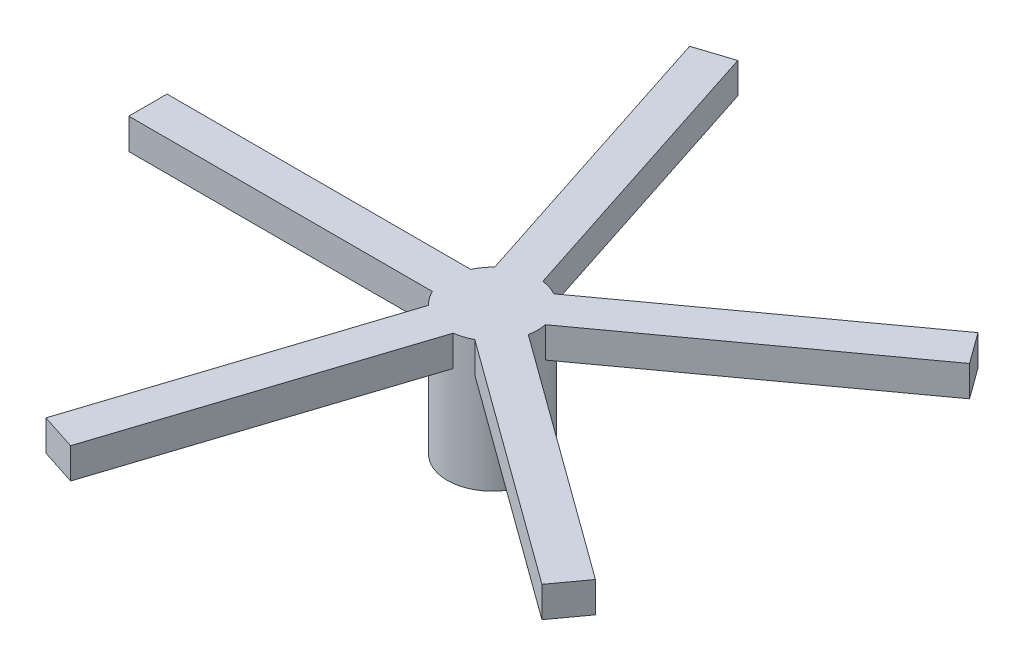
ISO-10303-21;
HEADER;
FILE_DESCRIPTION(('STEP AP214'),'2;1');
FILE_NAME('part.step','',(''),(''),'','','');
FILE_SCHEMA(('AUTOMOTIVE_DESIGN { 1 0 10303 214 1 1 1 1 }'));
ENDSEC;
DATA;
#1=APPLICATION_CONTEXT('core data for automotive mechanical design processes');
#2=APPLICATION_PROTOCOL_DEFINITION('international standard','automotive_design',2000,#1);
#3=PRODUCT_CONTEXT('',#1,'mechanical');
#4=PRODUCT('Part','Part','',(#3));
#5=PRODUCT_RELATED_PRODUCT_CATEGORY('part','',(#4));
#6=PRODUCT_DEFINITION_FORMATION('','',#4);
#7=PRODUCT_DEFINITION_CONTEXT('part definition',#1,'design');
#8=PRODUCT_DEFINITION('design','',#6,#7);
#9=PRODUCT_DEFINITION_SHAPE('','',#8);
#10=(LENGTH_UNIT() NAMED_UNIT(*) SI_UNIT(.MILLI.,.METRE.));
#11=(NAMED_UNIT(*) PLANE_ANGLE_UNIT() SI_UNIT($,.RADIAN.));
#12=(NAMED_UNIT(*) SI_UNIT($,.STERADIAN.) SOLID_ANGLE_UNIT());
#13=UNCERTAINTY_MEASURE_WITH_UNIT(LENGTH_MEASURE(1.E-05),#10,'distance_accuracy_value','');
#14=(GEOMETRIC_REPRESENTATION_CONTEXT(3) GLOBAL_UNCERTAINTY_ASSIGNED_CONTEXT((#13)) GLOBAL_UNIT_ASSIGNED_CONTEXT((#10,
#11,#12)) REPRESENTATION_CONTEXT('',''));
#15=CARTESIAN_POINT('',(0.,0.,0.));
#16=DIRECTION('',(0.,0.,1.));
#17=DIRECTION('',(1.,0.,0.));
#18=AXIS2_PLACEMENT_3D('',#15,#16,#17);
#19=CARTESIAN_POINT('',(0.,21.59,0.));
#20=DIRECTION('',(0.,-1.,0.));
#21=DIRECTION('',(0.,0.,-1.));
#22=AXIS2_PLACEMENT_3D('',#19,#20,#21);
#23=CYLINDRICAL_SURFACE('',#22,4.318);
#24=CARTESIAN_POINT('',(0.,0.,0.));
#25=DIRECTION('',(0.,1.,0.));
#26=DIRECTION('',(0.,0.,1.));
#27=AXIS2_PLACEMENT_3D('',#24,#25,#26);
#28=CIRCLE('',#27,4.318);
#29=CARTESIAN_POINT('',(0.,0.,4.318));
#30=VERTEX_POINT('',#29);
#31=EDGE_CURVE('E367',#30,#30,#28,.T.);
#32=ORIENTED_EDGE('',*,*,#31,.F.);
#33=EDGE_LOOP('',(#32));
#34=FACE_BOUND('',#33,.T.);
#35=CARTESIAN_POINT('',(0.,16.51,0.));
#36=DIRECTION('',(0.,1.,0.));
#37=DIRECTION('',(-1.,0.,0.));
#38=AXIS2_PLACEMENT_3D('',#35,#36,#37);
#39=CIRCLE('',#38,4.318);
#40=CARTESIAN_POINT('',(-4.318,16.51,0.));
#41=VERTEX_POINT('',#40);
#42=EDGE_CURVE('E11',#41,#41,#39,.T.);
#43=ORIENTED_EDGE('',*,*,#42,.T.);
#44=EDGE_LOOP('',(#43));
#45=FACE_BOUND('',#44,.T.);
#46=ADVANCED_FACE('F39',(#34,#45),#23,.F.);
#47=CARTESIAN_POINT('',(0.,21.59,0.));
#48=DIRECTION('',(0.,-1.,0.));
#49=DIRECTION('',(0.,0.,-1.));
#50=AXIS2_PLACEMENT_3D('',#47,#48,#49);
#51=CYLINDRICAL_SURFACE('',#50,7.493);
#52=CARTESIAN_POINT('',(0.,0.,0.));
#53=DIRECTION('',(0.,1.,0.));
#54=DIRECTION('',(0.,0.,1.));
#55=AXIS2_PLACEMENT_3D('',#52,#53,#54);
#56=CIRCLE('',#55,7.493);
#57=CARTESIAN_POINT('',(0.,0.,7.493));
#58=VERTEX_POINT('',#57);
#59=EDGE_CURVE('E371',#58,#58,#56,.T.);
#60=ORIENTED_EDGE('',*,*,#59,.T.);
#61=EDGE_LOOP('',(#60));
#62=FACE_BOUND('',#61,.T.);
#63=CARTESIAN_POINT('',(0.,16.51,0.));
#64=DIRECTION('',(0.,1.,0.));
#65=DIRECTION('',(0.,0.,1.));
#66=AXIS2_PLACEMENT_3D('',#63,#64,#65);
#67=CIRCLE('',#66,7.493);
#68=CARTESIAN_POINT('',(0.922282081097257,16.51,-7.43602345093713));
#69=VERTEX_POINT('',#68);
#70=CARTESIAN_POINT('',(-5.11692679737697,16.51,-5.47376553665623));
#71=VERTEX_POINT('',#70);
#72=EDGE_CURVE('E55',#69,#71,#67,.T.);
#73=ORIENTED_EDGE('',*,*,#72,.F.);
#74=DIRECTION('',(0.,-1.,0.));
#75=VECTOR('',#74,1.);
#76=CARTESIAN_POINT('',(0.92228208109726,21.59,-7.43602345093713));
#77=LINE('',#76,#75);
#78=CARTESIAN_POINT('',(0.922282081097259,21.59,-7.43602345093713));
#79=VERTEX_POINT('',#78);
#80=EDGE_CURVE('E324',#69,#79,#77,.F.);
#81=ORIENTED_EDGE('',*,*,#80,.T.);
#82=CARTESIAN_POINT('',(0.,21.59,0.));
#83=DIRECTION('',(0.,1.,0.));
#84=DIRECTION('',(0.,0.,1.));
#85=AXIS2_PLACEMENT_3D('',#82,#83,#84);
#86=CIRCLE('',#85,7.493);
#87=CARTESIAN_POINT('',(3.62464304294671,21.59,-6.55797314810132));
#88=VERTEX_POINT('',#87);
#89=EDGE_CURVE('E381',#88,#79,#86,.T.);
#90=ORIENTED_EDGE('',*,*,#89,.F.);
#91=DIRECTION('',(0.,-1.,0.));
#92=VECTOR('',#91,1.);
#93=CARTESIAN_POINT('',(3.6246430429467,21.59,-6.55797314810133));
#94=LINE('',#93,#92);
#95=CARTESIAN_POINT('',(3.6246430429467,16.51,-6.55797314810133));
#96=VERTEX_POINT('',#95);
#97=EDGE_CURVE('E317',#96,#88,#94,.F.);
#98=ORIENTED_EDGE('',*,*,#97,.F.);
#99=CARTESIAN_POINT('',(7.35707939500388,16.51,-1.42071523382039));
#100=VERTEX_POINT('',#99);
#101=EDGE_CURVE('E413',#100,#96,#67,.T.);
#102=ORIENTED_EDGE('',*,*,#101,.F.);
#103=DIRECTION('',(0.,-1.,0.));
#104=VECTOR('',#103,1.);
#105=CARTESIAN_POINT('',(7.35707939500388,21.59,-1.42071523382039));
#106=LINE('',#105,#104);
#107=CARTESIAN_POINT('',(7.35707939500388,21.59,-1.42071523382039));
#108=VERTEX_POINT('',#107);
#109=EDGE_CURVE('E321',#100,#108,#106,.F.);
#110=ORIENTED_EDGE('',*,*,#109,.T.);
#111=CARTESIAN_POINT('',(7.35707939500387,21.59,1.4207152338205));
#112=VERTEX_POINT('',#111);
#113=EDGE_CURVE('E387',#112,#108,#86,.T.);
#114=ORIENTED_EDGE('',*,*,#113,.F.);
#115=DIRECTION('',(0.,-1.,0.));
#116=VECTOR('',#115,1.);
#117=CARTESIAN_POINT('',(7.35707939500386,21.59,1.4207152338205));
#118=LINE('',#117,#116);
#119=CARTESIAN_POINT('',(7.35707939500386,16.51,1.4207152338205));
#120=VERTEX_POINT('',#119);
#121=EDGE_CURVE('E310',#120,#112,#118,.F.);
#122=ORIENTED_EDGE('',*,*,#121,.F.);
#123=CARTESIAN_POINT('',(3.62464304294661,16.51,6.55797314810138));
#124=VERTEX_POINT('',#123);
#125=EDGE_CURVE('E306',#124,#120,#67,.T.);
#126=ORIENTED_EDGE('',*,*,#125,.F.);
#127=DIRECTION('',(0.,-1.,0.));
#128=VECTOR('',#127,1.);
#129=CARTESIAN_POINT('',(3.62464304294661,21.59,6.55797314810138));
#130=LINE('',#129,#128);
#131=CARTESIAN_POINT('',(3.62464304294661,21.59,6.55797314810138));
#132=VERTEX_POINT('',#131);
#133=EDGE_CURVE('E314',#124,#132,#130,.F.);
#134=ORIENTED_EDGE('',*,*,#133,.T.);
#135=CARTESIAN_POINT('',(0.922282081097157,21.59,7.43602345093714));
#136=VERTEX_POINT('',#135);
#137=EDGE_CURVE('E374',#136,#132,#86,.T.);
#138=ORIENTED_EDGE('',*,*,#137,.F.);
#139=DIRECTION('',(0.,-1.,0.));
#140=VECTOR('',#139,1.);
#141=CARTESIAN_POINT('',(0.922282081097155,21.59,7.43602345093714));
#142=LINE('',#141,#140);
#143=CARTESIAN_POINT('',(0.922282081097155,16.51,7.43602345093714));
#144=VERTEX_POINT('',#143);
#145=EDGE_CURVE('E307',#144,#136,#142,.F.);
#146=ORIENTED_EDGE('',*,*,#145,.F.);
#147=CARTESIAN_POINT('',(-5.11692679737705,16.51,5.47376553665616));
#148=VERTEX_POINT('',#147);
#149=EDGE_CURVE('E183',#148,#144,#67,.T.);
#150=ORIENTED_EDGE('',*,*,#149,.F.);
#151=DIRECTION('',(0.,-1.,0.));
#152=VECTOR('',#151,1.);
#153=CARTESIAN_POINT('',(-5.11692679737705,21.59,5.47376553665616));
#154=LINE('',#153,#152);
#155=CARTESIAN_POINT('',(-5.11692679737705,21.59,5.47376553665616));
#156=VERTEX_POINT('',#155);
#157=EDGE_CURVE('E299',#148,#156,#154,.F.);
#158=ORIENTED_EDGE('',*,*,#157,.T.);
#159=CARTESIAN_POINT('',(-6.7870777216708,21.59,3.175));
#160=VERTEX_POINT('',#159);
#161=EDGE_CURVE('E48',#160,#156,#86,.T.);
#162=ORIENTED_EDGE('',*,*,#161,.F.);
#163=DIRECTION('',(0.,-1.,0.));
#164=VECTOR('',#163,1.);
#165=CARTESIAN_POINT('',(-6.78707772167079,21.59,3.175));
#166=LINE('',#165,#164);
#167=CARTESIAN_POINT('',(-6.7870777216708,16.51,3.175));
#168=VERTEX_POINT('',#167);
#169=EDGE_CURVE('E361',#168,#160,#166,.F.);
#170=ORIENTED_EDGE('',*,*,#169,.F.);
#171=CARTESIAN_POINT('',(0.,16.51,0.));
#172=DIRECTION('',(0.,1.,0.));
#173=DIRECTION('',(-1.,0.,0.));
#174=AXIS2_PLACEMENT_3D('',#171,#172,#173);
#175=CIRCLE('',#174,7.493);
#176=CARTESIAN_POINT('',(-6.7870777216708,16.51,-3.175));
#177=VERTEX_POINT('',#176);
#178=EDGE_CURVE('E364',#177,#168,#175,.T.);
#179=ORIENTED_EDGE('',*,*,#178,.F.);
#180=DIRECTION('',(0.,-1.,0.));
#181=VECTOR('',#180,1.);
#182=CARTESIAN_POINT('',(-6.78707772167079,21.59,-3.175));
#183=LINE('',#182,#181);
#184=CARTESIAN_POINT('',(-6.78707772167079,21.59,-3.175));
#185=VERTEX_POINT('',#184);
#186=EDGE_CURVE('E357',#177,#185,#183,.F.);
#187=ORIENTED_EDGE('',*,*,#186,.T.);
#188=CARTESIAN_POINT('',(-5.11692679737697,21.59,-5.47376553665622));
#189=VERTEX_POINT('',#188);
#190=EDGE_CURVE('E375',#189,#185,#86,.T.);
#191=ORIENTED_EDGE('',*,*,#190,.F.);
#192=DIRECTION('',(0.,-1.,0.));
#193=VECTOR('',#192,1.);
#194=CARTESIAN_POINT('',(-5.11692679737697,21.59,-5.47376553665623));
#195=LINE('',#194,#193);
#196=EDGE_CURVE('E60',#71,#189,#195,.F.);
#197=ORIENTED_EDGE('',*,*,#196,.F.);
#198=EDGE_LOOP('',(#73,#81,#90,#98,#102,#110,#114,#122,#126,#134,#138,#146,#150,#158,#162,#170,
#179,#187,#191,#197));
#199=FACE_BOUND('',#198,.T.);
#200=ADVANCED_FACE('F41',(#62,#199),#51,.T.);
#201=CARTESIAN_POINT('',(0.,21.59,0.));
#202=DIRECTION('',(0.,1.,0.));
#203=DIRECTION('',(0.,0.,1.));
#204=AXIS2_PLACEMENT_3D('',#201,#202,#203);
#205=PLANE('',#204);
#206=ORIENTED_EDGE('',*,*,#89,.T.);
#207=DIRECTION('',(-0.309016994374945,0.,-0.951056516295155));
#208=VECTOR('',#207,1.);
#209=CARTESIAN_POINT('',(-14.640716789291,21.59,-55.3340088634085));
#210=LINE('',#209,#208);
#211=CARTESIAN_POINT('',(-14.640716789291,21.59,-55.3340088634085));
#212=VERTEX_POINT('',#211);
#213=EDGE_CURVE('E275',#79,#212,#210,.T.);
#214=ORIENTED_EDGE('',*,*,#213,.T.);
#215=DIRECTION('',(0.951056516295154,0.,-0.309016994374945));
#216=VECTOR('',#215,1.);
#217=CARTESIAN_POINT('',(-20.6799256677652,21.59,-53.3717509491276));
#218=LINE('',#217,#216);
#219=CARTESIAN_POINT('',(-20.6799256677652,21.59,-53.3717509491276));
#220=VERTEX_POINT('',#219);
#221=EDGE_CURVE('E282',#220,#212,#218,.T.);
#222=ORIENTED_EDGE('',*,*,#221,.F.);
#223=DIRECTION('',(-0.309016994374945,0.,-0.951056516295155));
#224=VECTOR('',#223,1.);
#225=CARTESIAN_POINT('',(-20.6799256677652,21.59,-53.3717509491276));
#226=LINE('',#225,#224);
#227=EDGE_CURVE('E279',#189,#220,#226,.T.);
#228=ORIENTED_EDGE('',*,*,#227,.F.);
#229=ORIENTED_EDGE('',*,*,#190,.T.);
#230=DIRECTION('',(-1.,0.,0.));
#231=VECTOR('',#230,1.);
#232=CARTESIAN_POINT('',(-57.15,21.59,-3.175));
#233=LINE('',#232,#231);
#234=CARTESIAN_POINT('',(-57.15,21.59,-3.175));
#235=VERTEX_POINT('',#234);
#236=EDGE_CURVE('E333',#185,#235,#233,.T.);
#237=ORIENTED_EDGE('',*,*,#236,.T.);
#238=DIRECTION('',(0.,0.,-1.));
#239=VECTOR('',#238,1.);
#240=CARTESIAN_POINT('',(-57.15,21.59,3.175));
#241=LINE('',#240,#239);
#242=CARTESIAN_POINT('',(-57.15,21.59,3.175));
#243=VERTEX_POINT('',#242);
#244=EDGE_CURVE('E340',#243,#235,#241,.T.);
#245=ORIENTED_EDGE('',*,*,#244,.F.);
#246=DIRECTION('',(-1.,0.,0.));
#247=VECTOR('',#246,1.);
#248=CARTESIAN_POINT('',(-57.15,21.59,3.175));
#249=LINE('',#248,#247);
#250=EDGE_CURVE('E337',#160,#243,#249,.T.);
#251=ORIENTED_EDGE('',*,*,#250,.F.);
#252=ORIENTED_EDGE('',*,*,#161,.T.);
#253=DIRECTION('',(-0.309016994374958,0.,0.95105651629515));
#254=VECTOR('',#253,1.);
#255=CARTESIAN_POINT('',(-20.679925667766,21.59,53.3717509491273));
#256=LINE('',#255,#254);
#257=CARTESIAN_POINT('',(-20.679925667766,21.59,53.3717509491273));
#258=VERTEX_POINT('',#257);
#259=EDGE_CURVE('E197',#156,#258,#256,.T.);
#260=ORIENTED_EDGE('',*,*,#259,.T.);
#261=DIRECTION('',(-0.95105651629515,0.,-0.309016994374958));
#262=VECTOR('',#261,1.);
#263=CARTESIAN_POINT('',(-14.6407167892918,21.59,55.3340088634083));
#264=LINE('',#263,#262);
#265=CARTESIAN_POINT('',(-14.6407167892918,21.59,55.3340088634083));
#266=VERTEX_POINT('',#265);
#267=EDGE_CURVE('E204',#266,#258,#264,.T.);
#268=ORIENTED_EDGE('',*,*,#267,.F.);
#269=DIRECTION('',(-0.309016994374958,0.,0.95105651629515));
#270=VECTOR('',#269,1.);
#271=CARTESIAN_POINT('',(-14.6407167892918,21.59,55.3340088634083));
#272=LINE('',#271,#270);
#273=EDGE_CURVE('E187',#136,#266,#272,.T.);
#274=ORIENTED_EDGE('',*,*,#273,.F.);
#275=ORIENTED_EDGE('',*,*,#137,.T.);
#276=DIRECTION('',(0.809016994374942,0.,0.58778525229248));
#277=VECTOR('',#276,1.);
#278=CARTESIAN_POINT('',(44.3691030524993,21.59,36.1605561256557));
#279=LINE('',#278,#277);
#280=CARTESIAN_POINT('',(44.3691030524993,21.59,36.1605561256557));
#281=VERTEX_POINT('',#280);
#282=EDGE_CURVE('E219',#132,#281,#279,.T.);
#283=ORIENTED_EDGE('',*,*,#282,.T.);
#284=DIRECTION('',(-0.58778525229248,0.,0.809016994374942));
#285=VECTOR('',#284,1.);
#286=CARTESIAN_POINT('',(48.1015394045566,21.59,31.0232982113748));
#287=LINE('',#286,#285);
#288=CARTESIAN_POINT('',(48.1015394045566,21.59,31.0232982113748));
#289=VERTEX_POINT('',#288);
#290=EDGE_CURVE('E225',#289,#281,#287,.T.);
#291=ORIENTED_EDGE('',*,*,#290,.F.);
#292=DIRECTION('',(0.809016994374942,0.,0.58778525229248));
#293=VECTOR('',#292,1.);
#294=CARTESIAN_POINT('',(48.1015394045566,21.59,31.0232982113748));
#295=LINE('',#294,#293);
#296=EDGE_CURVE('E223',#112,#289,#295,.T.);
#297=ORIENTED_EDGE('',*,*,#296,.F.);
#298=ORIENTED_EDGE('',*,*,#113,.T.);
#299=DIRECTION('',(0.809016994374951,0.,-0.587785252292469));
#300=VECTOR('',#299,1.);
#301=CARTESIAN_POINT('',(48.101539404557,21.59,-31.0232982113741));
#302=LINE('',#301,#300);
#303=CARTESIAN_POINT('',(48.101539404557,21.59,-31.0232982113741));
#304=VERTEX_POINT('',#303);
#305=EDGE_CURVE('E245',#108,#304,#302,.T.);
#306=ORIENTED_EDGE('',*,*,#305,.T.);
#307=DIRECTION('',(0.587785252292468,0.,0.809016994374951));
#308=VECTOR('',#307,1.);
#309=CARTESIAN_POINT('',(44.3691030524999,21.59,-36.160556125655));
#310=LINE('',#309,#308);
#311=CARTESIAN_POINT('',(44.3691030524999,21.59,-36.160556125655));
#312=VERTEX_POINT('',#311);
#313=EDGE_CURVE('E252',#312,#304,#310,.T.);
#314=ORIENTED_EDGE('',*,*,#313,.F.);
#315=DIRECTION('',(0.809016994374951,0.,-0.587785252292469));
#316=VECTOR('',#315,1.);
#317=CARTESIAN_POINT('',(44.3691030524999,21.59,-36.160556125655));
#318=LINE('',#317,#316);
#319=EDGE_CURVE('E249',#88,#312,#318,.T.);
#320=ORIENTED_EDGE('',*,*,#319,.F.);
#321=EDGE_LOOP('',(#206,#214,#222,#228,#229,#237,#245,#251,#252,#260,#268,#274,#275,#283,#291,
#297,#298,#306,#314,#320));
#322=FACE_BOUND('',#321,.T.);
#323=ADVANCED_FACE('F397',(#322),#205,.T.);
#324=CARTESIAN_POINT('',(0.,0.,0.));
#325=DIRECTION('',(0.,1.,0.));
#326=DIRECTION('',(0.,0.,1.));
#327=AXIS2_PLACEMENT_3D('',#324,#325,#326);
#328=PLANE('',#327);
#329=ORIENTED_EDGE('',*,*,#59,.F.);
#330=EDGE_LOOP('',(#329));
#331=FACE_BOUND('',#330,.T.);
#332=ORIENTED_EDGE('',*,*,#31,.T.);
#333=EDGE_LOOP('',(#332));
#334=FACE_BOUND('',#333,.T.);
#335=ADVANCED_FACE('F463',(#331,#334),#328,.F.);
#336=CARTESIAN_POINT('',(-57.15,16.51,3.175));
#337=DIRECTION('',(0.,1.,0.));
#338=DIRECTION('',(-1.,0.,0.));
#339=AXIS2_PLACEMENT_3D('',#336,#337,#338);
#340=PLANE('',#339);
#341=ORIENTED_EDGE('',*,*,#42,.F.);
#342=EDGE_LOOP('',(#341));
#343=FACE_BOUND('',#342,.T.);
#344=ADVANCED_FACE('F465',(#343),#340,.F.);
#345=CARTESIAN_POINT('',(0.,0.,3.175));
#346=DIRECTION('',(0.,0.,-1.));
#347=DIRECTION('',(-1.,0.,0.));
#348=AXIS2_PLACEMENT_3D('',#345,#346,#347);
#349=PLANE('',#348);
#350=DIRECTION('',(1.,0.,0.));
#351=VECTOR('',#350,1.);
#352=CARTESIAN_POINT('',(-57.15,16.51,3.175));
#353=LINE('',#352,#351);
#354=CARTESIAN_POINT('',(-57.15,16.51,3.175));
#355=VERTEX_POINT('',#354);
#356=EDGE_CURVE('E332',#355,#168,#353,.T.);
#357=ORIENTED_EDGE('',*,*,#356,.T.);
#358=ORIENTED_EDGE('',*,*,#169,.T.);
#359=ORIENTED_EDGE('',*,*,#250,.T.);
#360=DIRECTION('',(0.,-1.,0.));
#361=VECTOR('',#360,1.);
#362=CARTESIAN_POINT('',(-57.15,16.51,3.175));
#363=LINE('',#362,#361);
#364=EDGE_CURVE('E328',#243,#355,#363,.T.);
#365=ORIENTED_EDGE('',*,*,#364,.T.);
#366=EDGE_LOOP('',(#357,#358,#359,#365));
#367=FACE_BOUND('',#366,.T.);
#368=ADVANCED_FACE('F470',(#367),#349,.F.);
#369=CARTESIAN_POINT('',(0.,0.,-3.175));
#370=DIRECTION('',(0.,0.,-1.));
#371=DIRECTION('',(-1.,0.,0.));
#372=AXIS2_PLACEMENT_3D('',#369,#370,#371);
#373=PLANE('',#372);
#374=ORIENTED_EDGE('',*,*,#186,.F.);
#375=DIRECTION('',(1.,0.,0.));
#376=VECTOR('',#375,1.);
#377=CARTESIAN_POINT('',(-57.15,16.51,-3.175));
#378=LINE('',#377,#376);
#379=CARTESIAN_POINT('',(-57.15,16.51,-3.175));
#380=VERTEX_POINT('',#379);
#381=EDGE_CURVE('E344',#380,#177,#378,.T.);
#382=ORIENTED_EDGE('',*,*,#381,.F.);
#383=DIRECTION('',(0.,-1.,0.));
#384=VECTOR('',#383,1.);
#385=CARTESIAN_POINT('',(-57.15,16.51,-3.175));
#386=LINE('',#385,#384);
#387=EDGE_CURVE('E327',#235,#380,#386,.T.);
#388=ORIENTED_EDGE('',*,*,#387,.F.);
#389=ORIENTED_EDGE('',*,*,#236,.F.);
#390=EDGE_LOOP('',(#374,#382,#388,#389));
#391=FACE_BOUND('',#390,.T.);
#392=ADVANCED_FACE('F477',(#391),#373,.T.);
#393=CARTESIAN_POINT('',(-57.15,16.51,3.175));
#394=DIRECTION('',(1.,0.,0.));
#395=DIRECTION('',(0.,0.,-1.));
#396=AXIS2_PLACEMENT_3D('',#393,#394,#395);
#397=PLANE('',#396);
#398=ORIENTED_EDGE('',*,*,#387,.T.);
#399=DIRECTION('',(0.,0.,-1.));
#400=VECTOR('',#399,1.);
#401=CARTESIAN_POINT('',(-57.15,16.51,3.175));
#402=LINE('',#401,#400);
#403=EDGE_CURVE('E353',#355,#380,#402,.T.);
#404=ORIENTED_EDGE('',*,*,#403,.F.);
#405=ORIENTED_EDGE('',*,*,#364,.F.);
#406=ORIENTED_EDGE('',*,*,#244,.T.);
#407=EDGE_LOOP('',(#398,#404,#405,#406));
#408=FACE_BOUND('',#407,.T.);
#409=ADVANCED_FACE('F460',(#408),#397,.F.);
#410=ORIENTED_EDGE('',*,*,#381,.T.);
#411=ORIENTED_EDGE('',*,*,#178,.T.);
#412=ORIENTED_EDGE('',*,*,#356,.F.);
#413=ORIENTED_EDGE('',*,*,#403,.T.);
#414=EDGE_LOOP('',(#410,#411,#412,#413));
#415=FACE_BOUND('',#414,.T.);
#416=ADVANCED_FACE('F472',(#415),#340,.F.);
#417=CARTESIAN_POINT('',(-14.6407167892918,16.51,55.3340088634083));
#418=DIRECTION('',(0.309016994374958,0.,-0.95105651629515));
#419=DIRECTION('',(-0.95105651629515,0.,-0.309016994374958));
#420=AXIS2_PLACEMENT_3D('',#417,#418,#419);
#421=PLANE('',#420);
#422=DIRECTION('',(0.,-1.,0.));
#423=VECTOR('',#422,1.);
#424=CARTESIAN_POINT('',(-20.679925667766,16.51,53.3717509491273));
#425=LINE('',#424,#423);
#426=CARTESIAN_POINT('',(-20.679925667766,16.51,53.3717509491273));
#427=VERTEX_POINT('',#426);
#428=EDGE_CURVE('E201',#258,#427,#425,.T.);
#429=ORIENTED_EDGE('',*,*,#428,.T.);
#430=DIRECTION('',(-0.95105651629515,0.,-0.309016994374958));
#431=VECTOR('',#430,1.);
#432=CARTESIAN_POINT('',(-14.6407167892918,16.51,55.3340088634083));
#433=LINE('',#432,#431);
#434=CARTESIAN_POINT('',(-14.6407167892918,16.51,55.3340088634083));
#435=VERTEX_POINT('',#434);
#436=EDGE_CURVE('E181',#435,#427,#433,.T.);
#437=ORIENTED_EDGE('',*,*,#436,.F.);
#438=DIRECTION('',(0.,-1.,0.));
#439=VECTOR('',#438,1.);
#440=CARTESIAN_POINT('',(-14.6407167892918,16.51,55.3340088634083));
#441=LINE('',#440,#439);
#442=EDGE_CURVE('E188',#266,#435,#441,.T.);
#443=ORIENTED_EDGE('',*,*,#442,.F.);
#444=ORIENTED_EDGE('',*,*,#267,.T.);
#445=EDGE_LOOP('',(#429,#437,#443,#444));
#446=FACE_BOUND('',#445,.T.);
#447=ADVANCED_FACE('F199',(#446),#421,.F.);
#448=CARTESIAN_POINT('',(-3.0196044392371,0.,-0.981128957140492));
#449=DIRECTION('',(-0.95105651629515,0.,-0.309016994374958));
#450=DIRECTION('',(-0.309016994374958,0.,0.95105651629515));
#451=AXIS2_PLACEMENT_3D('',#448,#449,#450);
#452=PLANE('',#451);
#453=ORIENTED_EDGE('',*,*,#157,.F.);
#454=DIRECTION('',(0.309016994374958,0.,-0.95105651629515));
#455=VECTOR('',#454,1.);
#456=CARTESIAN_POINT('',(-20.679925667766,16.51,53.3717509491273));
#457=LINE('',#456,#455);
#458=EDGE_CURVE('E716',#427,#148,#457,.T.);
#459=ORIENTED_EDGE('',*,*,#458,.F.);
#460=ORIENTED_EDGE('',*,*,#428,.F.);
#461=ORIENTED_EDGE('',*,*,#259,.F.);
#462=EDGE_LOOP('',(#453,#459,#460,#461));
#463=FACE_BOUND('',#462,.T.);
#464=ADVANCED_FACE('F488',(#463),#452,.T.);
#465=CARTESIAN_POINT('',(3.0196044392371,0.,0.981128957140492));
#466=DIRECTION('',(-0.95105651629515,0.,-0.309016994374958));
#467=DIRECTION('',(-0.309016994374958,0.,0.95105651629515));
#468=AXIS2_PLACEMENT_3D('',#465,#466,#467);
#469=PLANE('',#468);
#470=DIRECTION('',(0.309016994374958,0.,-0.95105651629515));
#471=VECTOR('',#470,1.);
#472=CARTESIAN_POINT('',(-14.6407167892918,16.51,55.3340088634083));
#473=LINE('',#472,#471);
#474=EDGE_CURVE('E176',#435,#144,#473,.T.);
#475=ORIENTED_EDGE('',*,*,#474,.T.);
#476=ORIENTED_EDGE('',*,*,#145,.T.);
#477=ORIENTED_EDGE('',*,*,#273,.T.);
#478=ORIENTED_EDGE('',*,*,#442,.T.);
#479=EDGE_LOOP('',(#475,#476,#477,#478));
#480=FACE_BOUND('',#479,.T.);
#481=ADVANCED_FACE('F191',(#480),#469,.F.);
#482=CARTESIAN_POINT('',(-20.6799256677652,16.51,-53.3717509491276));
#483=DIRECTION('',(0.,1.,0.));
#484=DIRECTION('',(0.,0.,1.));
#485=AXIS2_PLACEMENT_3D('',#482,#483,#484);
#486=PLANE('',#485);
#487=ORIENTED_EDGE('',*,*,#458,.T.);
#488=ORIENTED_EDGE('',*,*,#149,.T.);
#489=ORIENTED_EDGE('',*,*,#474,.F.);
#490=ORIENTED_EDGE('',*,*,#436,.T.);
#491=EDGE_LOOP('',(#487,#488,#489,#490));
#492=FACE_BOUND('',#491,.T.);
#493=ADVANCED_FACE('F179',(#492),#486,.F.);
#494=CARTESIAN_POINT('',(48.1015394045566,16.51,31.0232982113748));
#495=DIRECTION('',(-0.809016994374942,0.,-0.58778525229248));
#496=DIRECTION('',(-0.58778525229248,0.,0.809016994374942));
#497=AXIS2_PLACEMENT_3D('',#494,#495,#496);
#498=PLANE('',#497);
#499=DIRECTION('',(0.,-1.,0.));
#500=VECTOR('',#499,1.);
#501=CARTESIAN_POINT('',(44.3691030524993,16.51,36.1605561256557));
#502=LINE('',#501,#500);
#503=CARTESIAN_POINT('',(44.3691030524993,16.51,36.1605561256557));
#504=VERTEX_POINT('',#503);
#505=EDGE_CURVE('E203',#281,#504,#502,.T.);
#506=ORIENTED_EDGE('',*,*,#505,.T.);
#507=DIRECTION('',(-0.58778525229248,0.,0.809016994374942));
#508=VECTOR('',#507,1.);
#509=CARTESIAN_POINT('',(48.1015394045566,16.51,31.0232982113748));
#510=LINE('',#509,#508);
#511=CARTESIAN_POINT('',(48.1015394045566,16.51,31.0232982113748));
#512=VERTEX_POINT('',#511);
#513=EDGE_CURVE('E235',#512,#504,#510,.T.);
#514=ORIENTED_EDGE('',*,*,#513,.F.);
#515=DIRECTION('',(0.,-1.,0.));
#516=VECTOR('',#515,1.);
#517=CARTESIAN_POINT('',(48.1015394045566,16.51,31.0232982113748));
#518=LINE('',#517,#516);
#519=EDGE_CURVE('E214',#289,#512,#518,.T.);
#520=ORIENTED_EDGE('',*,*,#519,.F.);
#521=ORIENTED_EDGE('',*,*,#290,.T.);
#522=EDGE_LOOP('',(#506,#514,#520,#521));
#523=FACE_BOUND('',#522,.T.);
#524=ADVANCED_FACE('F405',(#523),#498,.F.);
#525=CARTESIAN_POINT('',(-1.86621817602862,0.,2.56862895714044));
#526=DIRECTION('',(-0.58778525229248,0.,0.809016994374942));
#527=DIRECTION('',(0.809016994374942,0.,0.58778525229248));
#528=AXIS2_PLACEMENT_3D('',#525,#526,#527);
#529=PLANE('',#528);
#530=ORIENTED_EDGE('',*,*,#133,.F.);
#531=DIRECTION('',(-0.809016994374942,0.,-0.58778525229248));
#532=VECTOR('',#531,1.);
#533=CARTESIAN_POINT('',(44.3691030524993,16.51,36.1605561256557));
#534=LINE('',#533,#532);
#535=EDGE_CURVE('E209',#504,#124,#534,.T.);
#536=ORIENTED_EDGE('',*,*,#535,.F.);
#537=ORIENTED_EDGE('',*,*,#505,.F.);
#538=ORIENTED_EDGE('',*,*,#282,.F.);
#539=EDGE_LOOP('',(#530,#536,#537,#538));
#540=FACE_BOUND('',#539,.T.);
#541=ADVANCED_FACE('F402',(#540),#529,.T.);
#542=CARTESIAN_POINT('',(1.86621817602862,0.,-2.56862895714044));
#543=DIRECTION('',(-0.58778525229248,0.,0.809016994374942));
#544=DIRECTION('',(0.809016994374942,0.,0.58778525229248));
#545=AXIS2_PLACEMENT_3D('',#542,#543,#544);
#546=PLANE('',#545);
#547=DIRECTION('',(-0.809016994374942,0.,-0.58778525229248));
#548=VECTOR('',#547,1.);
#549=CARTESIAN_POINT('',(48.1015394045566,16.51,31.0232982113748));
#550=LINE('',#549,#548);
#551=EDGE_CURVE('E218',#512,#120,#550,.T.);
#552=ORIENTED_EDGE('',*,*,#551,.T.);
#553=ORIENTED_EDGE('',*,*,#121,.T.);
#554=ORIENTED_EDGE('',*,*,#296,.T.);
#555=ORIENTED_EDGE('',*,*,#519,.T.);
#556=EDGE_LOOP('',(#552,#553,#554,#555));
#557=FACE_BOUND('',#556,.T.);
#558=ADVANCED_FACE('F408',(#557),#546,.F.);
#559=ORIENTED_EDGE('',*,*,#535,.T.);
#560=ORIENTED_EDGE('',*,*,#125,.T.);
#561=ORIENTED_EDGE('',*,*,#551,.F.);
#562=ORIENTED_EDGE('',*,*,#513,.T.);
#563=EDGE_LOOP('',(#559,#560,#561,#562));
#564=FACE_BOUND('',#563,.T.);
#565=ADVANCED_FACE('F411',(#564),#486,.F.);
#566=CARTESIAN_POINT('',(44.3691030524999,16.51,-36.160556125655));
#567=DIRECTION('',(-0.809016994374951,0.,0.587785252292469));
#568=DIRECTION('',(0.587785252292469,0.,0.809016994374951));
#569=AXIS2_PLACEMENT_3D('',#566,#567,#568);
#570=PLANE('',#569);
#571=DIRECTION('',(0.,-1.,0.));
#572=VECTOR('',#571,1.);
#573=CARTESIAN_POINT('',(48.101539404557,16.51,-31.0232982113741));
#574=LINE('',#573,#572);
#575=CARTESIAN_POINT('',(48.101539404557,16.51,-31.0232982113741));
#576=VERTEX_POINT('',#575);
#577=EDGE_CURVE('E239',#304,#576,#574,.T.);
#578=ORIENTED_EDGE('',*,*,#577,.T.);
#579=DIRECTION('',(0.587785252292468,0.,0.809016994374951));
#580=VECTOR('',#579,1.);
#581=CARTESIAN_POINT('',(44.3691030524999,16.51,-36.160556125655));
#582=LINE('',#581,#580);
#583=CARTESIAN_POINT('',(44.3691030524999,16.51,-36.160556125655));
#584=VERTEX_POINT('',#583);
#585=EDGE_CURVE('E265',#584,#576,#582,.T.);
#586=ORIENTED_EDGE('',*,*,#585,.F.);
#587=DIRECTION('',(0.,-1.,0.));
#588=VECTOR('',#587,1.);
#589=CARTESIAN_POINT('',(44.3691030524999,16.51,-36.160556125655));
#590=LINE('',#589,#588);
#591=EDGE_CURVE('E240',#312,#584,#590,.T.);
#592=ORIENTED_EDGE('',*,*,#591,.F.);
#593=ORIENTED_EDGE('',*,*,#313,.T.);
#594=EDGE_LOOP('',(#578,#586,#592,#593));
#595=FACE_BOUND('',#594,.T.);
#596=ADVANCED_FACE('F437',(#595),#570,.F.);
#597=CARTESIAN_POINT('',(1.86621817602859,0.,2.56862895714047));
#598=DIRECTION('',(0.587785252292469,0.,0.809016994374951));
#599=DIRECTION('',(0.809016994374951,0.,-0.587785252292469));
#600=AXIS2_PLACEMENT_3D('',#597,#598,#599);
#601=PLANE('',#600);
#602=ORIENTED_EDGE('',*,*,#109,.F.);
#603=DIRECTION('',(-0.809016994374951,0.,0.587785252292469));
#604=VECTOR('',#603,1.);
#605=CARTESIAN_POINT('',(48.101539404557,16.51,-31.0232982113741));
#606=LINE('',#605,#604);
#607=EDGE_CURVE('E256',#576,#100,#606,.T.);
#608=ORIENTED_EDGE('',*,*,#607,.F.);
#609=ORIENTED_EDGE('',*,*,#577,.F.);
#610=ORIENTED_EDGE('',*,*,#305,.F.);
#611=EDGE_LOOP('',(#602,#608,#609,#610));
#612=FACE_BOUND('',#611,.T.);
#613=ADVANCED_FACE('F441',(#612),#601,.T.);
#614=CARTESIAN_POINT('',(-1.86621817602859,0.,-2.56862895714047));
#615=DIRECTION('',(0.587785252292469,0.,0.809016994374951));
#616=DIRECTION('',(0.809016994374951,0.,-0.587785252292469));
#617=AXIS2_PLACEMENT_3D('',#614,#615,#616);
#618=PLANE('',#617);
#619=DIRECTION('',(-0.809016994374951,0.,0.587785252292469));
#620=VECTOR('',#619,1.);
#621=CARTESIAN_POINT('',(44.3691030524999,16.51,-36.160556125655));
#622=LINE('',#621,#620);
#623=EDGE_CURVE('E244',#584,#96,#622,.T.);
#624=ORIENTED_EDGE('',*,*,#623,.T.);
#625=ORIENTED_EDGE('',*,*,#97,.T.);
#626=ORIENTED_EDGE('',*,*,#319,.T.);
#627=ORIENTED_EDGE('',*,*,#591,.T.);
#628=EDGE_LOOP('',(#624,#625,#626,#627));
#629=FACE_BOUND('',#628,.T.);
#630=ADVANCED_FACE('F431',(#629),#618,.F.);
#631=ORIENTED_EDGE('',*,*,#607,.T.);
#632=ORIENTED_EDGE('',*,*,#101,.T.);
#633=ORIENTED_EDGE('',*,*,#623,.F.);
#634=ORIENTED_EDGE('',*,*,#585,.T.);
#635=EDGE_LOOP('',(#631,#632,#633,#634));
#636=FACE_BOUND('',#635,.T.);
#637=ADVANCED_FACE('F438',(#636),#486,.F.);
#638=CARTESIAN_POINT('',(3.01960443923711,0.,-0.98112895714045));
#639=DIRECTION('',(0.951056516295155,0.,-0.309016994374945));
#640=DIRECTION('',(-0.309016994374945,0.,-0.951056516295155));
#641=AXIS2_PLACEMENT_3D('',#638,#639,#640);
#642=PLANE('',#641);
#643=ORIENTED_EDGE('',*,*,#80,.F.);
#644=DIRECTION('',(0.309016994374945,0.,0.951056516295155));
#645=VECTOR('',#644,1.);
#646=CARTESIAN_POINT('',(-14.640716789291,16.51,-55.3340088634085));
#647=LINE('',#646,#645);
#648=CARTESIAN_POINT('',(-14.640716789291,16.51,-55.3340088634085));
#649=VERTEX_POINT('',#648);
#650=EDGE_CURVE('E286',#649,#69,#647,.T.);
#651=ORIENTED_EDGE('',*,*,#650,.F.);
#652=DIRECTION('',(0.,-1.,0.));
#653=VECTOR('',#652,1.);
#654=CARTESIAN_POINT('',(-14.640716789291,16.51,-55.3340088634085));
#655=LINE('',#654,#653);
#656=EDGE_CURVE('E269',#212,#649,#655,.T.);
#657=ORIENTED_EDGE('',*,*,#656,.F.);
#658=ORIENTED_EDGE('',*,*,#213,.F.);
#659=EDGE_LOOP('',(#643,#651,#657,#658));
#660=FACE_BOUND('',#659,.T.);
#661=ADVANCED_FACE('F429',(#660),#642,.T.);
#662=ORIENTED_EDGE('',*,*,#650,.T.);
#663=ORIENTED_EDGE('',*,*,#72,.T.);
#664=DIRECTION('',(0.309016994374945,0.,0.951056516295155));
#665=VECTOR('',#664,1.);
#666=CARTESIAN_POINT('',(-20.6799256677652,16.51,-53.3717509491276));
#667=LINE('',#666,#665);
#668=CARTESIAN_POINT('',(-20.6799256677652,16.51,-53.3717509491276));
#669=VERTEX_POINT('',#668);
#670=EDGE_CURVE('E274',#669,#71,#667,.T.);
#671=ORIENTED_EDGE('',*,*,#670,.F.);
#672=DIRECTION('',(0.951056516295154,0.,-0.309016994374945));
#673=VECTOR('',#672,1.);
#674=CARTESIAN_POINT('',(-20.6799256677652,16.51,-53.3717509491276));
#675=LINE('',#674,#673);
#676=EDGE_CURVE('E295',#669,#649,#675,.T.);
#677=ORIENTED_EDGE('',*,*,#676,.T.);
#678=EDGE_LOOP('',(#662,#663,#671,#677));
#679=FACE_BOUND('',#678,.T.);
#680=ADVANCED_FACE('F419',(#679),#486,.F.);
#681=CARTESIAN_POINT('',(-3.01960443923711,0.,0.98112895714045));
#682=DIRECTION('',(0.951056516295155,0.,-0.309016994374945));
#683=DIRECTION('',(-0.309016994374945,0.,-0.951056516295155));
#684=AXIS2_PLACEMENT_3D('',#681,#682,#683);
#685=PLANE('',#684);
#686=ORIENTED_EDGE('',*,*,#670,.T.);
#687=ORIENTED_EDGE('',*,*,#196,.T.);
#688=ORIENTED_EDGE('',*,*,#227,.T.);
#689=DIRECTION('',(0.,-1.,0.));
#690=VECTOR('',#689,1.);
#691=CARTESIAN_POINT('',(-20.6799256677652,16.51,-53.3717509491276));
#692=LINE('',#691,#690);
#693=EDGE_CURVE('E270',#220,#669,#692,.T.);
#694=ORIENTED_EDGE('',*,*,#693,.T.);
#695=EDGE_LOOP('',(#686,#687,#688,#694));
#696=FACE_BOUND('',#695,.T.);
#697=ADVANCED_FACE('F421',(#696),#685,.F.);
#698=CARTESIAN_POINT('',(-20.6799256677652,16.51,-53.3717509491276));
#699=DIRECTION('',(0.309016994374945,0.,0.951056516295155));
#700=DIRECTION('',(0.951056516295155,0.,-0.309016994374945));
#701=AXIS2_PLACEMENT_3D('',#698,#699,#700);
#702=PLANE('',#701);
#703=ORIENTED_EDGE('',*,*,#656,.T.);
#704=ORIENTED_EDGE('',*,*,#676,.F.);
#705=ORIENTED_EDGE('',*,*,#693,.F.);
#706=ORIENTED_EDGE('',*,*,#221,.T.);
#707=EDGE_LOOP('',(#703,#704,#705,#706));
#708=FACE_BOUND('',#707,.T.);
#709=ADVANCED_FACE('F426',(#708),#702,.F.);
#710=CLOSED_SHELL('',(#46,#200,#323,#335,#344,#368,#392,#409,#416,#447,#464,#481,#493,#524,#541,
#558,#565,#596,#613,#630,#637,#661,#680,#697,#709));
#711=MANIFOLD_SOLID_BREP('B2',#710);
#712=ADVANCED_BREP_SHAPE_REPRESENTATION('',(#18,#711),#14);
#713=SHAPE_DEFINITION_REPRESENTATION(#9,#712);
ENDSEC;
END-ISO-10303-21;
